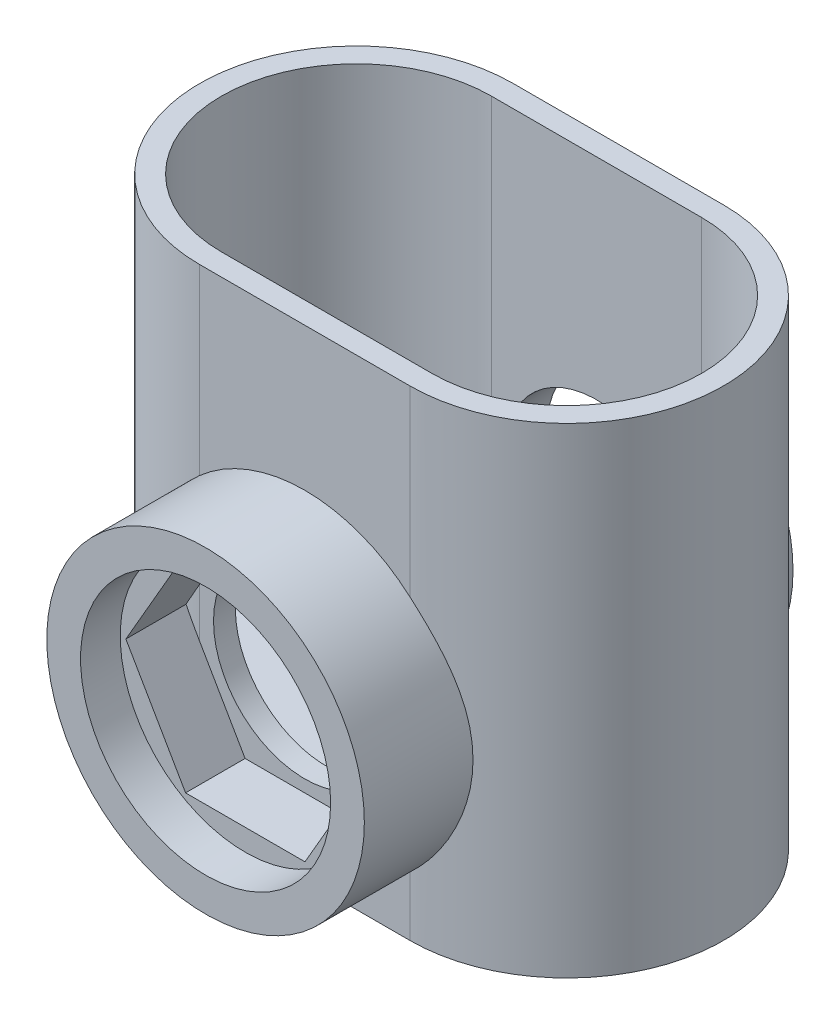
ISO-10303-21;
HEADER;
FILE_DESCRIPTION(('STEP AP214'),'2;1');
FILE_NAME('part.step','',(''),(''),'','','');
FILE_SCHEMA(('AUTOMOTIVE_DESIGN { 1 0 10303 214 1 1 1 1 }'));
ENDSEC;
DATA;
#1=APPLICATION_CONTEXT('core data for automotive mechanical design processes');
#2=APPLICATION_PROTOCOL_DEFINITION('international standard','automotive_design',2000,#1);
#3=PRODUCT_CONTEXT('',#1,'mechanical');
#4=PRODUCT('Part','Part','',(#3));
#5=PRODUCT_RELATED_PRODUCT_CATEGORY('part','',(#4));
#6=PRODUCT_DEFINITION_FORMATION('','',#4);
#7=PRODUCT_DEFINITION_CONTEXT('part definition',#1,'design');
#8=PRODUCT_DEFINITION('design','',#6,#7);
#9=PRODUCT_DEFINITION_SHAPE('','',#8);
#10=(LENGTH_UNIT() NAMED_UNIT(*) SI_UNIT(.MILLI.,.METRE.));
#11=(NAMED_UNIT(*) PLANE_ANGLE_UNIT() SI_UNIT($,.RADIAN.));
#12=(NAMED_UNIT(*) SI_UNIT($,.STERADIAN.) SOLID_ANGLE_UNIT());
#13=UNCERTAINTY_MEASURE_WITH_UNIT(LENGTH_MEASURE(1.E-05),#10,'distance_accuracy_value','');
#14=(GEOMETRIC_REPRESENTATION_CONTEXT(3) GLOBAL_UNCERTAINTY_ASSIGNED_CONTEXT((#13)) GLOBAL_UNIT_ASSIGNED_CONTEXT((#10,
#11,#12)) REPRESENTATION_CONTEXT('',''));
#15=CARTESIAN_POINT('',(0.,0.,0.));
#16=DIRECTION('',(0.,0.,1.));
#17=DIRECTION('',(1.,0.,0.));
#18=AXIS2_PLACEMENT_3D('',#15,#16,#17);
#19=CARTESIAN_POINT('',(5.3,9.,12.9));
#20=DIRECTION('',(0.,0.,-1.));
#21=DIRECTION('',(-1.,0.,0.));
#22=AXIS2_PLACEMENT_3D('',#19,#20,#21);
#23=CYLINDRICAL_SURFACE('',#22,4.6);
#24=CARTESIAN_POINT('',(5.3,9.,-6.8));
#25=DIRECTION('',(0.,0.,-1.));
#26=DIRECTION('',(-1.,0.,0.));
#27=AXIS2_PLACEMENT_3D('',#24,#25,#26);
#28=CIRCLE('',#27,4.6);
#29=CARTESIAN_POINT('',(0.700000000000001,9.,-6.8));
#30=VERTEX_POINT('',#29);
#31=EDGE_CURVE('E58',#30,#30,#28,.F.);
#32=ORIENTED_EDGE('',*,*,#31,.T.);
#33=EDGE_LOOP('',(#32));
#34=FACE_BOUND('',#33,.T.);
#35=CARTESIAN_POINT('',(5.3,9.,-8.9));
#36=DIRECTION('',(0.,0.,-1.));
#37=DIRECTION('',(-1.,0.,0.));
#38=AXIS2_PLACEMENT_3D('',#35,#36,#37);
#39=CIRCLE('',#38,4.6);
#40=CARTESIAN_POINT('',(0.700000000000001,9.,-8.9));
#41=VERTEX_POINT('',#40);
#42=EDGE_CURVE('E232',#41,#41,#39,.T.);
#43=ORIENTED_EDGE('',*,*,#42,.T.);
#44=EDGE_LOOP('',(#43));
#45=FACE_BOUND('',#44,.T.);
#46=ADVANCED_FACE('F54',(#34,#45),#23,.F.);
#47=CARTESIAN_POINT('',(0.,24.2,-7.9));
#48=DIRECTION('',(0.,0.,1.));
#49=DIRECTION('',(1.,0.,0.));
#50=AXIS2_PLACEMENT_3D('',#47,#48,#49);
#51=PLANE('',#50);
#52=CARTESIAN_POINT('',(5.3,9.,-7.9));
#53=DIRECTION('',(0.,0.,-1.));
#54=DIRECTION('',(-1.,0.,0.));
#55=AXIS2_PLACEMENT_3D('',#52,#53,#54);
#56=CIRCLE('',#55,7.8);
#57=CARTESIAN_POINT('',(10.6,3.2772384288702,-7.9));
#58=VERTEX_POINT('',#57);
#59=CARTESIAN_POINT('',(0.,3.2772384288702,-7.9));
#60=VERTEX_POINT('',#59);
#61=EDGE_CURVE('E79',#58,#60,#56,.T.);
#62=ORIENTED_EDGE('',*,*,#61,.F.);
#63=DIRECTION('',(0.,-1.,0.));
#64=VECTOR('',#63,1.);
#65=CARTESIAN_POINT('',(10.6,24.2,-7.9));
#66=LINE('',#65,#64);
#67=CARTESIAN_POINT('',(10.6,0.,-7.9));
#68=VERTEX_POINT('',#67);
#69=EDGE_CURVE('E356',#58,#68,#66,.T.);
#70=ORIENTED_EDGE('',*,*,#69,.T.);
#71=DIRECTION('',(-1.,0.,0.));
#72=VECTOR('',#71,1.);
#73=CARTESIAN_POINT('',(0.,0.,-7.9));
#74=LINE('',#73,#72);
#75=CARTESIAN_POINT('',(0.,0.,-7.9));
#76=VERTEX_POINT('',#75);
#77=EDGE_CURVE('E336',#68,#76,#74,.T.);
#78=ORIENTED_EDGE('',*,*,#77,.T.);
#79=DIRECTION('',(0.,-1.,0.));
#80=VECTOR('',#79,1.);
#81=CARTESIAN_POINT('',(0.,24.2,-7.9));
#82=LINE('',#81,#80);
#83=EDGE_CURVE('E342',#60,#76,#82,.T.);
#84=ORIENTED_EDGE('',*,*,#83,.F.);
#85=EDGE_LOOP('',(#62,#70,#78,#84));
#86=FACE_BOUND('',#85,.T.);
#87=ADVANCED_FACE('F393',(#86),#51,.F.);
#88=CARTESIAN_POINT('',(0.,14.7227615711298,-7.9));
#89=VERTEX_POINT('',#88);
#90=CARTESIAN_POINT('',(10.6,14.7227615711298,-7.9));
#91=VERTEX_POINT('',#90);
#92=EDGE_CURVE('E240',#89,#91,#56,.T.);
#93=ORIENTED_EDGE('',*,*,#92,.F.);
#94=CARTESIAN_POINT('',(0.,24.2,-7.9));
#95=VERTEX_POINT('',#94);
#96=EDGE_CURVE('E353',#95,#89,#82,.T.);
#97=ORIENTED_EDGE('',*,*,#96,.F.);
#98=DIRECTION('',(-1.,0.,0.));
#99=VECTOR('',#98,1.);
#100=CARTESIAN_POINT('',(0.,24.2,-7.9));
#101=LINE('',#100,#99);
#102=CARTESIAN_POINT('',(10.6,24.2,-7.9));
#103=VERTEX_POINT('',#102);
#104=EDGE_CURVE('E340',#103,#95,#101,.T.);
#105=ORIENTED_EDGE('',*,*,#104,.F.);
#106=EDGE_CURVE('E357',#103,#91,#66,.T.);
#107=ORIENTED_EDGE('',*,*,#106,.T.);
#108=EDGE_LOOP('',(#93,#97,#105,#107));
#109=FACE_BOUND('',#108,.T.);
#110=ADVANCED_FACE('F399',(#109),#51,.F.);
#111=CARTESIAN_POINT('',(0.,24.2,7.9));
#112=DIRECTION('',(0.,0.,-1.));
#113=DIRECTION('',(-1.,0.,0.));
#114=AXIS2_PLACEMENT_3D('',#111,#112,#113);
#115=PLANE('',#114);
#116=DIRECTION('',(0.,-1.,0.));
#117=VECTOR('',#116,1.);
#118=CARTESIAN_POINT('',(10.6,24.2,7.9));
#119=LINE('',#118,#117);
#120=CARTESIAN_POINT('',(10.6,3.00750469336854,7.9));
#121=VERTEX_POINT('',#120);
#122=CARTESIAN_POINT('',(10.6,0.,7.9));
#123=VERTEX_POINT('',#122);
#124=EDGE_CURVE('E359',#121,#123,#119,.T.);
#125=ORIENTED_EDGE('',*,*,#124,.F.);
#126=CARTESIAN_POINT('',(5.3,9.,7.90000000000646));
#127=DIRECTION('',(0.,0.,-1.));
#128=DIRECTION('',(-1.,0.,0.));
#129=AXIS2_PLACEMENT_3D('',#126,#127,#128);
#130=CIRCLE('',#129,8.);
#131=CARTESIAN_POINT('',(0.,3.00750469336854,7.9));
#132=VERTEX_POINT('',#131);
#133=EDGE_CURVE('E311',#132,#121,#130,.F.);
#134=ORIENTED_EDGE('',*,*,#133,.F.);
#135=DIRECTION('',(0.,-1.,0.));
#136=VECTOR('',#135,1.);
#137=CARTESIAN_POINT('',(0.,24.2,7.9));
#138=LINE('',#137,#136);
#139=CARTESIAN_POINT('',(0.,0.,7.9));
#140=VERTEX_POINT('',#139);
#141=EDGE_CURVE('E363',#132,#140,#138,.T.);
#142=ORIENTED_EDGE('',*,*,#141,.T.);
#143=DIRECTION('',(1.,0.,0.));
#144=VECTOR('',#143,1.);
#145=CARTESIAN_POINT('',(0.,0.,7.9));
#146=LINE('',#145,#144);
#147=EDGE_CURVE('E345',#140,#123,#146,.T.);
#148=ORIENTED_EDGE('',*,*,#147,.T.);
#149=EDGE_LOOP('',(#125,#134,#142,#148));
#150=FACE_BOUND('',#149,.T.);
#151=ADVANCED_FACE('F422',(#150),#115,.F.);
#152=CARTESIAN_POINT('',(0.,24.2,0.));
#153=DIRECTION('',(0.,-1.,0.));
#154=DIRECTION('',(0.,0.,-1.));
#155=AXIS2_PLACEMENT_3D('',#152,#153,#154);
#156=CYLINDRICAL_SURFACE('',#155,7.9);
#157=ORIENTED_EDGE('',*,*,#141,.F.);
#158=CARTESIAN_POINT('',(0.,14.9924953066315,7.9));
#159=CARTESIAN_POINT('',(-0.165659654042323,14.8460206283481,7.89999934958821));
#160=CARTESIAN_POINT('',(-0.325125716478624,14.6927039418768,7.89479037197899));
#161=CARTESIAN_POINT('',(-0.630504441524312,14.3737955911347,7.87628349925471));
#162=CARTESIAN_POINT('',(-0.776428295026014,14.2082142692084,7.86299235286839));
#163=CARTESIAN_POINT('',(-1.05369916417834,13.8661061195597,7.83065711055396));
#164=CARTESIAN_POINT('',(-1.18506043031419,13.6895902605375,7.81161870787881));
#165=CARTESIAN_POINT('',(-1.43266342855662,13.326604945252,7.77002182860017));
#166=CARTESIAN_POINT('',(-1.54890200233335,13.1401334212094,7.74746261884344));
#167=CARTESIAN_POINT('',(-1.76535237537247,12.7588238090764,7.70102332508906));
#168=CARTESIAN_POINT('',(-1.86559896624349,12.5640050863881,7.67714626492542));
#169=CARTESIAN_POINT('',(-2.04980814620565,12.1667420014171,7.63002810366607));
#170=CARTESIAN_POINT('',(-2.13377095767161,11.9642977433155,7.60678699388942));
#171=CARTESIAN_POINT('',(-2.2848637203706,11.5530034457817,7.56277686205978));
#172=CARTESIAN_POINT('',(-2.35199730782574,11.3441548010832,7.54200730649843));
#173=CARTESIAN_POINT('',(-2.46895935597311,10.9212989348312,7.50453305494014));
#174=CARTESIAN_POINT('',(-2.51878765816819,10.7072916660496,7.48782839617354));
#175=CARTESIAN_POINT('',(-2.60164662354409,10.2706221716192,7.45945075989015));
#176=CARTESIAN_POINT('',(-2.63426802769808,10.0478738839944,7.44790130089661));
#177=CARTESIAN_POINT('',(-2.68062892361512,9.60017193729785,7.43134163705504));
#178=CARTESIAN_POINT('',(-2.69436829056254,9.37521826365782,7.42633147543363));
#179=CARTESIAN_POINT('',(-2.70281529175459,8.92497740375368,7.42326142735091));
#180=CARTESIAN_POINT('',(-2.69752899363168,8.69969034671917,7.42519932502571));
#181=CARTESIAN_POINT('',(-2.66799541178477,8.25053326748999,7.43586214006958));
#182=CARTESIAN_POINT('',(-2.64374875180376,8.0266631989246,7.44458683417194));
#183=CARTESIAN_POINT('',(-2.57843553069375,7.59454677883346,7.46744846645516));
#184=CARTESIAN_POINT('',(-2.53838725389512,7.3861277165097,7.48125484962938));
#185=CARTESIAN_POINT('',(-2.44196525949885,6.97345808200345,7.51328044972511));
#186=CARTESIAN_POINT('',(-2.38559191676759,6.76920741421895,7.53149956531713));
#187=CARTESIAN_POINT('',(-2.25685676397906,6.36584055140364,7.57107207794247));
#188=CARTESIAN_POINT('',(-2.18447473154368,6.1667312094253,7.5924294276768));
#189=CARTESIAN_POINT('',(-2.02422693440841,5.77502193449221,7.63671468134105));
#190=CARTESIAN_POINT('',(-1.93636049541726,5.58242228544709,7.65964265363947));
#191=CARTESIAN_POINT('',(-1.7409570056299,5.1955065058327,7.70646807783583));
#192=CARTESIAN_POINT('',(-1.63266660248392,5.00156941317087,7.73035793101838));
#193=CARTESIAN_POINT('',(-1.40016919144706,4.62312234081302,7.77583138310324));
#194=CARTESIAN_POINT('',(-1.27595843103882,4.43861459805509,7.79741443607322));
#195=CARTESIAN_POINT('',(-1.01273479136636,4.08079536807202,7.83594359951493));
#196=CARTESIAN_POINT('',(-0.873766114614969,3.90745281228961,7.85290304295537));
#197=CARTESIAN_POINT('',(-0.581654865537745,3.57271709921554,7.87992091926252));
#198=CARTESIAN_POINT('',(-0.428524086428894,3.41131419746685,7.88998503638584));
#199=CARTESIAN_POINT('',(-0.225048015561031,3.21401815693188,7.89691598622943));
#200=CARTESIAN_POINT('',(-0.180692272938848,3.17198573349581,7.89806066824444));
#201=CARTESIAN_POINT('',(-0.0910468224072934,3.08896451586404,7.89960238262781));
#202=CARTESIAN_POINT('',(-0.0457576352332591,3.04797516684869,7.89999982102299));
#203=CARTESIAN_POINT('',(0.,3.00750469336854,7.9));
#204=B_SPLINE_CURVE_WITH_KNOTS('',3,(#158,#159,#160,#161,#162,#163,#164,#165,#166,#167,#168,
#169,#170,#171,#172,#173,#174,#175,#176,#177,#178,#179,#180,#181,#182,#183,#184,#185,#186,#187,
#188,#189,#190,#191,#192,#193,#194,#195,#196,#197,#198,#199,#200,#201,#202,#203),.UNSPECIFIED.,
.F.,.F.,(4,2,2,2,2,2,2,2,2,2,2,2,2,2,2,2,2,2,2,2,2,2,4),(0.,0.662981875407768,1.32541091002921,
1.98718588144885,2.64909884151636,3.30955152723226,3.96999519302776,4.63029603620857,
5.2906029268507,5.96597762938779,6.64135679632178,7.31652059157958,7.99166217676743,
8.62898434784936,9.26629188550103,9.90440912344751,10.5425541560181,11.2119948281525,
11.8815935823791,12.5492405041256,13.2163363776241,13.3996777805269,13.58291953311),.UNSPECIFIED.);
#205=CARTESIAN_POINT('',(0.,14.9924953066315,7.9));
#206=VERTEX_POINT('',#205);
#207=EDGE_CURVE('E285',#206,#132,#204,.T.);
#208=ORIENTED_EDGE('',*,*,#207,.F.);
#209=CARTESIAN_POINT('',(0.,24.2,7.9));
#210=VERTEX_POINT('',#209);
#211=EDGE_CURVE('E63',#210,#206,#138,.T.);
#212=ORIENTED_EDGE('',*,*,#211,.F.);
#213=CARTESIAN_POINT('',(0.,24.2,0.));
#214=DIRECTION('',(0.,1.,0.));
#215=DIRECTION('',(0.,0.,1.));
#216=AXIS2_PLACEMENT_3D('',#213,#214,#215);
#217=CIRCLE('',#216,7.9);
#218=EDGE_CURVE('E332',#95,#210,#217,.T.);
#219=ORIENTED_EDGE('',*,*,#218,.F.);
#220=ORIENTED_EDGE('',*,*,#96,.T.);
#221=DIRECTION('',(0.,-1.,0.));
#222=VECTOR('',#221,1.);
#223=CARTESIAN_POINT('',(0.,24.2,-7.9));
#224=LINE('',#223,#222);
#225=EDGE_CURVE('E246',#89,#60,#224,.T.);
#226=ORIENTED_EDGE('',*,*,#225,.T.);
#227=ORIENTED_EDGE('',*,*,#83,.T.);
#228=CARTESIAN_POINT('',(0.,0.,0.));
#229=DIRECTION('',(0.,1.,0.));
#230=DIRECTION('',(0.,0.,1.));
#231=AXIS2_PLACEMENT_3D('',#228,#229,#230);
#232=CIRCLE('',#231,7.9);
#233=EDGE_CURVE('E320',#76,#140,#232,.T.);
#234=ORIENTED_EDGE('',*,*,#233,.T.);
#235=EDGE_LOOP('',(#157,#208,#212,#219,#220,#226,#227,#234));
#236=FACE_BOUND('',#235,.T.);
#237=ADVANCED_FACE('F56',(#236),#156,.T.);
#238=ORIENTED_EDGE('',*,*,#211,.T.);
#239=CARTESIAN_POINT('',(10.6,14.9924953066315,7.90000000000646));
#240=VERTEX_POINT('',#239);
#241=EDGE_CURVE('E294',#240,#206,#130,.F.);
#242=ORIENTED_EDGE('',*,*,#241,.F.);
#243=CARTESIAN_POINT('',(10.6,24.2,7.9));
#244=VERTEX_POINT('',#243);
#245=EDGE_CURVE('E360',#244,#240,#119,.T.);
#246=ORIENTED_EDGE('',*,*,#245,.F.);
#247=DIRECTION('',(1.,0.,0.));
#248=VECTOR('',#247,1.);
#249=CARTESIAN_POINT('',(0.,24.2,7.9));
#250=LINE('',#249,#248);
#251=EDGE_CURVE('E335',#210,#244,#250,.T.);
#252=ORIENTED_EDGE('',*,*,#251,.F.);
#253=EDGE_LOOP('',(#238,#242,#246,#252));
#254=FACE_BOUND('',#253,.T.);
#255=ADVANCED_FACE('F423',(#254),#115,.F.);
#256=CARTESIAN_POINT('',(10.6,24.2,0.));
#257=DIRECTION('',(0.,-1.,0.));
#258=DIRECTION('',(0.,0.,-1.));
#259=AXIS2_PLACEMENT_3D('',#256,#257,#258);
#260=CYLINDRICAL_SURFACE('',#259,7.9);
#261=ORIENTED_EDGE('',*,*,#245,.T.);
#262=CARTESIAN_POINT('',(10.6,3.00750469336854,7.9));
#263=CARTESIAN_POINT('',(10.7656596540423,3.15397937165192,7.89999934958821));
#264=CARTESIAN_POINT('',(10.9251257164786,3.30729605812319,7.89479037197899));
#265=CARTESIAN_POINT('',(11.2305044415243,3.62620440886528,7.87628349925471));
#266=CARTESIAN_POINT('',(11.376428295026,3.79178573079156,7.86299235286839));
#267=CARTESIAN_POINT('',(11.6536991641783,4.13389388044027,7.83065711055396));
#268=CARTESIAN_POINT('',(11.7850604303142,4.31040973946249,7.81161870787881));
#269=CARTESIAN_POINT('',(12.0326634285566,4.67339505474797,7.77002182860017));
#270=CARTESIAN_POINT('',(12.1489020023334,4.85986657879061,7.74746261884344));
#271=CARTESIAN_POINT('',(12.3653523753725,5.24117619092359,7.70102332508906));
#272=CARTESIAN_POINT('',(12.4655989662435,5.43599491361189,7.67714626492542));
#273=CARTESIAN_POINT('',(12.6498081462056,5.83325799858287,7.63002810366607));
#274=CARTESIAN_POINT('',(12.7337709576716,6.03570225668449,7.60678699388942));
#275=CARTESIAN_POINT('',(12.8848637203706,6.44699655421832,7.56277686205978));
#276=CARTESIAN_POINT('',(12.9519973078257,6.65584519891677,7.54200730649843));
#277=CARTESIAN_POINT('',(13.0689593559731,7.07870106516878,7.50453305494014));
#278=CARTESIAN_POINT('',(13.1187876581682,7.29270833395039,7.48782839617354));
#279=CARTESIAN_POINT('',(13.2016466235441,7.72937782838078,7.45945075989015));
#280=CARTESIAN_POINT('',(13.2342680276981,7.9521261160056,7.44790130089661));
#281=CARTESIAN_POINT('',(13.2806289236151,8.39982806270214,7.43134163705504));
#282=CARTESIAN_POINT('',(13.2943682905625,8.62478173634218,7.42633147543363));
#283=CARTESIAN_POINT('',(13.3028152917546,9.07502259624631,7.42326142735091));
#284=CARTESIAN_POINT('',(13.2975289936317,9.30030965328083,7.42519932502571));
#285=CARTESIAN_POINT('',(13.2679954117848,9.74946673251,7.43586214006958));
#286=CARTESIAN_POINT('',(13.2437487518038,9.97333680107539,7.44458683417194));
#287=CARTESIAN_POINT('',(13.1784355306938,10.4054532211665,7.46744846645516));
#288=CARTESIAN_POINT('',(13.1383872538951,10.6138722834903,7.48125484962938));
#289=CARTESIAN_POINT('',(13.0419652594989,11.0265419179965,7.51328044972511));
#290=CARTESIAN_POINT('',(12.9855919167676,11.230792585781,7.53149956531713));
#291=CARTESIAN_POINT('',(12.8568567639791,11.6341594485963,7.57107207794247));
#292=CARTESIAN_POINT('',(12.7844747315437,11.8332687905747,7.5924294276768));
#293=CARTESIAN_POINT('',(12.6242269344084,12.2249780655078,7.63671468134105));
#294=CARTESIAN_POINT('',(12.5363604954173,12.4175777145529,7.65964265363947));
#295=CARTESIAN_POINT('',(12.3409570056299,12.8044934941673,7.70646807783583));
#296=CARTESIAN_POINT('',(12.2326666024839,12.9984305868291,7.73035793101838));
#297=CARTESIAN_POINT('',(12.0001691914471,13.376877659187,7.77583138310323));
#298=CARTESIAN_POINT('',(11.8759584310388,13.5613854019449,7.79741443607321));
#299=CARTESIAN_POINT('',(11.6127347913664,13.919204631928,7.83594359951493));
#300=CARTESIAN_POINT('',(11.473766114615,14.0925471877104,7.85290304295537));
#301=CARTESIAN_POINT('',(11.1816548655378,14.4272829007845,7.87992091926252));
#302=CARTESIAN_POINT('',(11.0285240864289,14.5886858025331,7.88998503638584));
#303=CARTESIAN_POINT('',(10.825048015561,14.7859818430681,7.89691598622943));
#304=CARTESIAN_POINT('',(10.7806922729389,14.8280142665042,7.89806066824444));
#305=CARTESIAN_POINT('',(10.6910468224073,14.911035484136,7.89960238262781));
#306=CARTESIAN_POINT('',(10.6457576352333,14.9520248331513,7.89999982102299));
#307=CARTESIAN_POINT('',(10.6,14.9924953066315,7.9));
#308=B_SPLINE_CURVE_WITH_KNOTS('',3,(#262,#263,#264,#265,#266,#267,#268,#269,#270,#271,#272,
#273,#274,#275,#276,#277,#278,#279,#280,#281,#282,#283,#284,#285,#286,#287,#288,#289,#290,#291,
#292,#293,#294,#295,#296,#297,#298,#299,#300,#301,#302,#303,#304,#305,#306,#307),.UNSPECIFIED.,
.F.,.F.,(4,2,2,2,2,2,2,2,2,2,2,2,2,2,2,2,2,2,2,2,2,2,4),(0.,0.662981875407767,1.32541091002921,
1.98718588144885,2.64909884151636,3.30955152723226,3.96999519302775,4.63029603620857,
5.2906029268507,5.96597762938779,6.64135679632178,7.31652059157957,7.99166217676742,
8.62898434784936,9.26629188550102,9.90440912344751,10.5425541560181,11.2119948281525,
11.8815935823791,12.5492405041256,13.2163363776241,13.3996777805269,13.58291953311),.UNSPECIFIED.);
#309=EDGE_CURVE('E305',#121,#240,#308,.T.);
#310=ORIENTED_EDGE('',*,*,#309,.F.);
#311=ORIENTED_EDGE('',*,*,#124,.T.);
#312=CARTESIAN_POINT('',(10.6,0.,0.));
#313=DIRECTION('',(0.,1.,0.));
#314=DIRECTION('',(0.,0.,1.));
#315=AXIS2_PLACEMENT_3D('',#312,#313,#314);
#316=CIRCLE('',#315,7.9);
#317=EDGE_CURVE('E348',#123,#68,#316,.T.);
#318=ORIENTED_EDGE('',*,*,#317,.T.);
#319=ORIENTED_EDGE('',*,*,#69,.F.);
#320=DIRECTION('',(0.,-1.,0.));
#321=VECTOR('',#320,1.);
#322=CARTESIAN_POINT('',(10.6,24.2,-7.9));
#323=LINE('',#322,#321);
#324=EDGE_CURVE('E239',#91,#58,#323,.T.);
#325=ORIENTED_EDGE('',*,*,#324,.F.);
#326=ORIENTED_EDGE('',*,*,#106,.F.);
#327=CARTESIAN_POINT('',(10.6,24.2,0.));
#328=DIRECTION('',(0.,1.,0.));
#329=DIRECTION('',(0.,0.,1.));
#330=AXIS2_PLACEMENT_3D('',#327,#328,#329);
#331=CIRCLE('',#330,7.9);
#332=EDGE_CURVE('E338',#244,#103,#331,.T.);
#333=ORIENTED_EDGE('',*,*,#332,.F.);
#334=EDGE_LOOP('',(#261,#310,#311,#318,#319,#325,#326,#333));
#335=FACE_BOUND('',#334,.T.);
#336=ADVANCED_FACE('F471',(#335),#260,.T.);
#337=CARTESIAN_POINT('',(0.,24.2,0.));
#338=DIRECTION('',(0.,1.,0.));
#339=DIRECTION('',(0.,0.,1.));
#340=AXIS2_PLACEMENT_3D('',#337,#338,#339);
#341=PLANE('',#340);
#342=DIRECTION('',(-1.,0.,0.));
#343=VECTOR('',#342,1.);
#344=CARTESIAN_POINT('',(0.,24.2,-6.8));
#345=LINE('',#344,#343);
#346=CARTESIAN_POINT('',(10.6,24.2,-6.8));
#347=VERTEX_POINT('',#346);
#348=CARTESIAN_POINT('',(0.,24.2,-6.8));
#349=VERTEX_POINT('',#348);
#350=EDGE_CURVE('E71',#347,#349,#345,.T.);
#351=ORIENTED_EDGE('',*,*,#350,.F.);
#352=CARTESIAN_POINT('',(10.6,24.2,0.));
#353=DIRECTION('',(0.,1.,0.));
#354=DIRECTION('',(0.,0.,1.));
#355=AXIS2_PLACEMENT_3D('',#352,#353,#354);
#356=CIRCLE('',#355,6.8);
#357=CARTESIAN_POINT('',(10.6,24.2,6.8));
#358=VERTEX_POINT('',#357);
#359=EDGE_CURVE('E213',#358,#347,#356,.T.);
#360=ORIENTED_EDGE('',*,*,#359,.F.);
#361=DIRECTION('',(1.,0.,0.));
#362=VECTOR('',#361,1.);
#363=CARTESIAN_POINT('',(0.,24.2,6.8));
#364=LINE('',#363,#362);
#365=CARTESIAN_POINT('',(0.,24.2,6.8));
#366=VERTEX_POINT('',#365);
#367=EDGE_CURVE('E216',#366,#358,#364,.T.);
#368=ORIENTED_EDGE('',*,*,#367,.F.);
#369=CARTESIAN_POINT('',(0.,24.2,0.));
#370=DIRECTION('',(0.,1.,0.));
#371=DIRECTION('',(0.,0.,1.));
#372=AXIS2_PLACEMENT_3D('',#369,#370,#371);
#373=CIRCLE('',#372,6.8);
#374=EDGE_CURVE('E222',#349,#366,#373,.T.);
#375=ORIENTED_EDGE('',*,*,#374,.F.);
#376=EDGE_LOOP('',(#351,#360,#368,#375));
#377=FACE_BOUND('',#376,.T.);
#378=ORIENTED_EDGE('',*,*,#218,.T.);
#379=ORIENTED_EDGE('',*,*,#251,.T.);
#380=ORIENTED_EDGE('',*,*,#332,.T.);
#381=ORIENTED_EDGE('',*,*,#104,.T.);
#382=EDGE_LOOP('',(#378,#379,#380,#381));
#383=FACE_BOUND('',#382,.T.);
#384=ADVANCED_FACE('F303',(#377,#383),#341,.T.);
#385=CARTESIAN_POINT('',(0.,0.,0.));
#386=DIRECTION('',(0.,1.,0.));
#387=DIRECTION('',(0.,0.,1.));
#388=AXIS2_PLACEMENT_3D('',#385,#386,#387);
#389=PLANE('',#388);
#390=ORIENTED_EDGE('',*,*,#233,.F.);
#391=ORIENTED_EDGE('',*,*,#77,.F.);
#392=ORIENTED_EDGE('',*,*,#317,.F.);
#393=ORIENTED_EDGE('',*,*,#147,.F.);
#394=EDGE_LOOP('',(#390,#391,#392,#393));
#395=FACE_BOUND('',#394,.T.);
#396=ADVANCED_FACE('F465',(#395),#389,.F.);
#397=CARTESIAN_POINT('',(5.3,9.,12.9));
#398=DIRECTION('',(0.,0.,1.));
#399=DIRECTION('',(1.,0.,0.));
#400=AXIS2_PLACEMENT_3D('',#397,#398,#399);
#401=PLANE('',#400);
#402=CARTESIAN_POINT('',(5.3,9.,12.9));
#403=DIRECTION('',(0.,0.,1.));
#404=DIRECTION('',(1.,0.,0.));
#405=AXIS2_PLACEMENT_3D('',#402,#403,#404);
#406=CIRCLE('',#405,6.3);
#407=CARTESIAN_POINT('',(11.6,9.,12.9));
#408=VERTEX_POINT('',#407);
#409=EDGE_CURVE('E254',#408,#408,#406,.T.);
#410=ORIENTED_EDGE('',*,*,#409,.F.);
#411=EDGE_LOOP('',(#410));
#412=FACE_BOUND('',#411,.T.);
#413=CARTESIAN_POINT('',(5.3,9.,12.9));
#414=DIRECTION('',(0.,0.,1.));
#415=DIRECTION('',(1.,0.,0.));
#416=AXIS2_PLACEMENT_3D('',#413,#414,#415);
#417=CIRCLE('',#416,8.);
#418=CARTESIAN_POINT('',(13.3,9.,12.9));
#419=VERTEX_POINT('',#418);
#420=EDGE_CURVE('E266',#419,#419,#417,.T.);
#421=ORIENTED_EDGE('',*,*,#420,.T.);
#422=EDGE_LOOP('',(#421));
#423=FACE_BOUND('',#422,.T.);
#424=ADVANCED_FACE('F620',(#412,#423),#401,.T.);
#425=CARTESIAN_POINT('',(5.3,9.,-500000.));
#426=DIRECTION('',(0.,0.,1.));
#427=DIRECTION('',(1.,0.,0.));
#428=AXIS2_PLACEMENT_3D('',#425,#426,#427);
#429=CYLINDRICAL_SURFACE('',#428,8.);
#430=ORIENTED_EDGE('',*,*,#420,.F.);
#431=EDGE_LOOP('',(#430));
#432=FACE_BOUND('',#431,.T.);
#433=ORIENTED_EDGE('',*,*,#133,.T.);
#434=ORIENTED_EDGE('',*,*,#309,.T.);
#435=ORIENTED_EDGE('',*,*,#241,.T.);
#436=ORIENTED_EDGE('',*,*,#207,.T.);
#437=EDGE_LOOP('',(#433,#434,#435,#436));
#438=FACE_BOUND('',#437,.T.);
#439=ADVANCED_FACE('F296',(#432,#438),#429,.T.);
#440=CARTESIAN_POINT('',(5.3,9.,10.9));
#441=DIRECTION('',(0.,0.,1.));
#442=DIRECTION('',(1.,0.,0.));
#443=AXIS2_PLACEMENT_3D('',#440,#441,#442);
#444=PLANE('',#443);
#445=CARTESIAN_POINT('',(5.3,9.,10.9));
#446=DIRECTION('',(0.,0.,1.));
#447=DIRECTION('',(1.,0.,0.));
#448=AXIS2_PLACEMENT_3D('',#445,#446,#447);
#449=CIRCLE('',#448,6.3);
#450=CARTESIAN_POINT('',(11.6,9.,10.9));
#451=VERTEX_POINT('',#450);
#452=EDGE_CURVE('E250',#451,#451,#449,.T.);
#453=ORIENTED_EDGE('',*,*,#452,.T.);
#454=EDGE_LOOP('',(#453));
#455=FACE_BOUND('',#454,.T.);
#456=DIRECTION('',(-0.5,-0.866025403784439,0.));
#457=VECTOR('',#456,1.);
#458=CARTESIAN_POINT('',(8.30799490247795,3.79,10.8999999999924));
#459=LINE('',#458,#457);
#460=CARTESIAN_POINT('',(11.3159898049559,9.,10.8999999999924));
#461=VERTEX_POINT('',#460);
#462=CARTESIAN_POINT('',(8.30799490247795,3.79,10.8999999999924));
#463=VERTEX_POINT('',#462);
#464=EDGE_CURVE('E264',#461,#463,#459,.T.);
#465=ORIENTED_EDGE('',*,*,#464,.T.);
#466=DIRECTION('',(-1.,0.,0.));
#467=VECTOR('',#466,1.);
#468=CARTESIAN_POINT('',(2.29200509752205,3.79,10.8999999999924));
#469=LINE('',#468,#467);
#470=CARTESIAN_POINT('',(2.29200509752205,3.79,10.8999999999924));
#471=VERTEX_POINT('',#470);
#472=EDGE_CURVE('E262',#463,#471,#469,.T.);
#473=ORIENTED_EDGE('',*,*,#472,.T.);
#474=DIRECTION('',(-0.5,0.866025403784439,0.));
#475=VECTOR('',#474,1.);
#476=CARTESIAN_POINT('',(-0.715989804955899,9.,10.8999999999924));
#477=LINE('',#476,#475);
#478=CARTESIAN_POINT('',(-0.715989804955898,9.,10.8999999999924));
#479=VERTEX_POINT('',#478);
#480=EDGE_CURVE('E260',#471,#479,#477,.T.);
#481=ORIENTED_EDGE('',*,*,#480,.T.);
#482=DIRECTION('',(0.5,0.866025403784439,0.));
#483=VECTOR('',#482,1.);
#484=CARTESIAN_POINT('',(2.29200509752205,14.21,10.8999999999924));
#485=LINE('',#484,#483);
#486=CARTESIAN_POINT('',(2.29200509752205,14.21,10.8999999998787));
#487=VERTEX_POINT('',#486);
#488=EDGE_CURVE('E258',#479,#487,#485,.T.);
#489=ORIENTED_EDGE('',*,*,#488,.T.);
#490=DIRECTION('',(1.,0.,0.));
#491=VECTOR('',#490,1.);
#492=CARTESIAN_POINT('',(8.30799490247796,14.21,10.8999999999924));
#493=LINE('',#492,#491);
#494=CARTESIAN_POINT('',(8.30799490247796,14.21,10.8999999999924));
#495=VERTEX_POINT('',#494);
#496=EDGE_CURVE('E12',#487,#495,#493,.T.);
#497=ORIENTED_EDGE('',*,*,#496,.T.);
#498=DIRECTION('',(0.5,-0.866025403784439,0.));
#499=VECTOR('',#498,1.);
#500=CARTESIAN_POINT('',(11.3159898049559,9.,10.8999999999924));
#501=LINE('',#500,#499);
#502=EDGE_CURVE('E253',#495,#461,#501,.T.);
#503=ORIENTED_EDGE('',*,*,#502,.T.);
#504=EDGE_LOOP('',(#465,#473,#481,#489,#497,#503));
#505=FACE_BOUND('',#504,.T.);
#506=ADVANCED_FACE('F609',(#455,#505),#444,.T.);
#507=CARTESIAN_POINT('',(5.3,9.,10.9));
#508=DIRECTION('',(0.,0.,1.));
#509=DIRECTION('',(1.,0.,0.));
#510=AXIS2_PLACEMENT_3D('',#507,#508,#509);
#511=CYLINDRICAL_SURFACE('',#510,6.3);
#512=ORIENTED_EDGE('',*,*,#452,.F.);
#513=EDGE_LOOP('',(#512));
#514=FACE_BOUND('',#513,.T.);
#515=ORIENTED_EDGE('',*,*,#409,.T.);
#516=EDGE_LOOP('',(#515));
#517=FACE_BOUND('',#516,.T.);
#518=ADVANCED_FACE('F604',(#514,#517),#511,.F.);
#519=CARTESIAN_POINT('',(0.,7.75986928011505,0.));
#520=DIRECTION('',(-0.866025403784439,-0.5,0.));
#521=DIRECTION('',(0.5,-0.866025403784439,0.));
#522=AXIS2_PLACEMENT_3D('',#519,#520,#521);
#523=ELLIPSE('',#522,15.8,7.9);
#524=CARTESIAN_POINT('',(-0.715989804955899,9.,7.8674874385456));
#525=VERTEX_POINT('',#524);
#526=CARTESIAN_POINT('',(0.,7.75986928011505,7.9));
#527=VERTEX_POINT('',#526);
#528=EDGE_CURVE('E316',#525,#527,#523,.F.);
#529=ORIENTED_EDGE('',*,*,#528,.T.);
#530=CARTESIAN_POINT('',(0.,10.2401307198849,7.9));
#531=VERTEX_POINT('',#530);
#532=EDGE_CURVE('E366',#531,#527,#138,.T.);
#533=ORIENTED_EDGE('',*,*,#532,.F.);
#534=CARTESIAN_POINT('',(0.,10.2401307198849,0.));
#535=DIRECTION('',(-0.866025403784439,0.5,0.));
#536=DIRECTION('',(-0.5,-0.866025403784439,0.));
#537=AXIS2_PLACEMENT_3D('',#534,#535,#536);
#538=ELLIPSE('',#537,15.8,7.9);
#539=EDGE_CURVE('E312',#531,#525,#538,.F.);
#540=ORIENTED_EDGE('',*,*,#539,.T.);
#541=EDGE_LOOP('',(#529,#533,#540));
#542=FACE_BOUND('',#541,.T.);
#543=ADVANCED_FACE('F453',(#542),#156,.T.);
#544=CARTESIAN_POINT('',(10.6,7.75986928011505,0.));
#545=DIRECTION('',(0.866025403784439,-0.5,0.));
#546=DIRECTION('',(-0.5,-0.866025403784439,0.));
#547=AXIS2_PLACEMENT_3D('',#544,#545,#546);
#548=ELLIPSE('',#547,15.8,7.9);
#549=CARTESIAN_POINT('',(10.6,7.75986928011505,7.9));
#550=VERTEX_POINT('',#549);
#551=CARTESIAN_POINT('',(11.3159898049559,9.,7.8674874385456));
#552=VERTEX_POINT('',#551);
#553=EDGE_CURVE('E324',#550,#552,#548,.F.);
#554=ORIENTED_EDGE('',*,*,#553,.T.);
#555=CARTESIAN_POINT('',(10.6,10.240130719885,0.));
#556=DIRECTION('',(0.866025403784439,0.5,0.));
#557=DIRECTION('',(0.5,-0.866025403784439,0.));
#558=AXIS2_PLACEMENT_3D('',#555,#556,#557);
#559=ELLIPSE('',#558,15.8,7.9);
#560=CARTESIAN_POINT('',(10.6,10.240130719885,7.9));
#561=VERTEX_POINT('',#560);
#562=EDGE_CURVE('E310',#552,#561,#559,.F.);
#563=ORIENTED_EDGE('',*,*,#562,.T.);
#564=EDGE_CURVE('E364',#561,#550,#119,.T.);
#565=ORIENTED_EDGE('',*,*,#564,.T.);
#566=EDGE_LOOP('',(#554,#563,#565));
#567=FACE_BOUND('',#566,.T.);
#568=ADVANCED_FACE('F421',(#567),#260,.T.);
#569=CARTESIAN_POINT('',(5.3,9.,7.9));
#570=DIRECTION('',(0.,0.,-1.));
#571=DIRECTION('',(-1.,0.,0.));
#572=AXIS2_PLACEMENT_3D('',#569,#570,#571);
#573=CIRCLE('',#572,4.6);
#574=CARTESIAN_POINT('',(0.700000000000001,9.,7.9));
#575=VERTEX_POINT('',#574);
#576=EDGE_CURVE('E249',#575,#575,#573,.T.);
#577=ORIENTED_EDGE('',*,*,#576,.T.);
#578=EDGE_LOOP('',(#577));
#579=FACE_BOUND('',#578,.T.);
#580=DIRECTION('',(0.5,0.866025403784439,0.));
#581=VECTOR('',#580,1.);
#582=CARTESIAN_POINT('',(8.30799490247795,3.79,7.90000000000646));
#583=LINE('',#582,#581);
#584=CARTESIAN_POINT('',(8.30799490247795,3.79,7.9));
#585=VERTEX_POINT('',#584);
#586=EDGE_CURVE('E328',#585,#550,#583,.T.);
#587=ORIENTED_EDGE('',*,*,#586,.T.);
#588=ORIENTED_EDGE('',*,*,#564,.F.);
#589=DIRECTION('',(-0.5,0.866025403784439,0.));
#590=VECTOR('',#589,1.);
#591=CARTESIAN_POINT('',(11.3159898049559,9.,7.90000000000646));
#592=LINE('',#591,#590);
#593=CARTESIAN_POINT('',(8.30799490247796,14.21,7.9));
#594=VERTEX_POINT('',#593);
#595=EDGE_CURVE('E322',#561,#594,#592,.T.);
#596=ORIENTED_EDGE('',*,*,#595,.T.);
#597=DIRECTION('',(-1.,0.,0.));
#598=VECTOR('',#597,1.);
#599=CARTESIAN_POINT('',(8.30799490247796,14.21,7.90000000000646));
#600=LINE('',#599,#598);
#601=CARTESIAN_POINT('',(2.29200509752205,14.21,7.9));
#602=VERTEX_POINT('',#601);
#603=EDGE_CURVE('E314',#594,#602,#600,.T.);
#604=ORIENTED_EDGE('',*,*,#603,.T.);
#605=DIRECTION('',(-0.5,-0.866025403784439,0.));
#606=VECTOR('',#605,1.);
#607=CARTESIAN_POINT('',(2.29200509752205,14.21,7.90000000000646));
#608=LINE('',#607,#606);
#609=EDGE_CURVE('E315',#602,#531,#608,.T.);
#610=ORIENTED_EDGE('',*,*,#609,.T.);
#611=ORIENTED_EDGE('',*,*,#532,.T.);
#612=DIRECTION('',(0.5,-0.866025403784439,0.));
#613=VECTOR('',#612,1.);
#614=CARTESIAN_POINT('',(-0.715989804955899,9.,7.90000000000646));
#615=LINE('',#614,#613);
#616=CARTESIAN_POINT('',(2.29200509752205,3.79,7.9));
#617=VERTEX_POINT('',#616);
#618=EDGE_CURVE('E318',#527,#617,#615,.T.);
#619=ORIENTED_EDGE('',*,*,#618,.T.);
#620=DIRECTION('',(1.,0.,0.));
#621=VECTOR('',#620,1.);
#622=CARTESIAN_POINT('',(2.29200509752205,3.79,7.90000000000646));
#623=LINE('',#622,#621);
#624=EDGE_CURVE('E326',#617,#585,#623,.T.);
#625=ORIENTED_EDGE('',*,*,#624,.T.);
#626=EDGE_LOOP('',(#587,#588,#596,#604,#610,#611,#619,#625));
#627=FACE_BOUND('',#626,.T.);
#628=ADVANCED_FACE('F417',(#579,#627),#115,.F.);
#629=CARTESIAN_POINT('',(8.30799490247796,14.21,-500000.));
#630=DIRECTION('',(0.,1.,0.));
#631=DIRECTION('',(0.,0.,1.));
#632=AXIS2_PLACEMENT_3D('',#629,#630,#631);
#633=PLANE('',#632);
#634=ORIENTED_EDGE('',*,*,#496,.F.);
#635=DIRECTION('',(0.,0.,1.));
#636=VECTOR('',#635,1.);
#637=CARTESIAN_POINT('',(2.29200509752205,14.21,-500000.));
#638=LINE('',#637,#636);
#639=EDGE_CURVE('E272',#602,#487,#638,.T.);
#640=ORIENTED_EDGE('',*,*,#639,.F.);
#641=ORIENTED_EDGE('',*,*,#603,.F.);
#642=DIRECTION('',(0.,0.,1.));
#643=VECTOR('',#642,1.);
#644=CARTESIAN_POINT('',(8.30799490247796,14.21,-500000.));
#645=LINE('',#644,#643);
#646=EDGE_CURVE('E269',#594,#495,#645,.T.);
#647=ORIENTED_EDGE('',*,*,#646,.T.);
#648=EDGE_LOOP('',(#634,#640,#641,#647));
#649=FACE_BOUND('',#648,.T.);
#650=ADVANCED_FACE('F420',(#649),#633,.F.);
#651=CARTESIAN_POINT('',(11.3159898049559,9.,-500000.));
#652=DIRECTION('',(0.866025403784439,0.5,0.));
#653=DIRECTION('',(-0.5,0.866025403784439,0.));
#654=AXIS2_PLACEMENT_3D('',#651,#652,#653);
#655=PLANE('',#654);
#656=ORIENTED_EDGE('',*,*,#502,.F.);
#657=ORIENTED_EDGE('',*,*,#646,.F.);
#658=ORIENTED_EDGE('',*,*,#595,.F.);
#659=ORIENTED_EDGE('',*,*,#562,.F.);
#660=DIRECTION('',(0.,0.,1.));
#661=VECTOR('',#660,1.);
#662=CARTESIAN_POINT('',(11.3159898049559,9.,-500000.));
#663=LINE('',#662,#661);
#664=EDGE_CURVE('E282',#552,#461,#663,.T.);
#665=ORIENTED_EDGE('',*,*,#664,.T.);
#666=EDGE_LOOP('',(#656,#657,#658,#659,#665));
#667=FACE_BOUND('',#666,.T.);
#668=ADVANCED_FACE('F437',(#667),#655,.F.);
#669=CARTESIAN_POINT('',(2.29200509752205,14.21,-500000.));
#670=DIRECTION('',(-0.866025403784439,0.5,0.));
#671=DIRECTION('',(-0.5,-0.866025403784439,0.));
#672=AXIS2_PLACEMENT_3D('',#669,#670,#671);
#673=PLANE('',#672);
#674=ORIENTED_EDGE('',*,*,#488,.F.);
#675=DIRECTION('',(0.,0.,1.));
#676=VECTOR('',#675,1.);
#677=CARTESIAN_POINT('',(-0.715989804955899,9.,-500000.));
#678=LINE('',#677,#676);
#679=EDGE_CURVE('E275',#525,#479,#678,.T.);
#680=ORIENTED_EDGE('',*,*,#679,.F.);
#681=ORIENTED_EDGE('',*,*,#539,.F.);
#682=ORIENTED_EDGE('',*,*,#609,.F.);
#683=ORIENTED_EDGE('',*,*,#639,.T.);
#684=EDGE_LOOP('',(#674,#680,#681,#682,#683));
#685=FACE_BOUND('',#684,.T.);
#686=ADVANCED_FACE('F446',(#685),#673,.F.);
#687=CARTESIAN_POINT('',(-0.715989804955899,9.,-500000.));
#688=DIRECTION('',(-0.866025403784439,-0.5,0.));
#689=DIRECTION('',(0.5,-0.866025403784439,0.));
#690=AXIS2_PLACEMENT_3D('',#687,#688,#689);
#691=PLANE('',#690);
#692=ORIENTED_EDGE('',*,*,#480,.F.);
#693=DIRECTION('',(0.,0.,1.));
#694=VECTOR('',#693,1.);
#695=CARTESIAN_POINT('',(2.29200509752205,3.79,-500000.));
#696=LINE('',#695,#694);
#697=EDGE_CURVE('E278',#617,#471,#696,.T.);
#698=ORIENTED_EDGE('',*,*,#697,.F.);
#699=ORIENTED_EDGE('',*,*,#618,.F.);
#700=ORIENTED_EDGE('',*,*,#528,.F.);
#701=ORIENTED_EDGE('',*,*,#679,.T.);
#702=EDGE_LOOP('',(#692,#698,#699,#700,#701));
#703=FACE_BOUND('',#702,.T.);
#704=ADVANCED_FACE('F565',(#703),#691,.F.);
#705=CARTESIAN_POINT('',(2.29200509752205,3.79,-500000.));
#706=DIRECTION('',(0.,-1.,0.));
#707=DIRECTION('',(0.,0.,-1.));
#708=AXIS2_PLACEMENT_3D('',#705,#706,#707);
#709=PLANE('',#708);
#710=ORIENTED_EDGE('',*,*,#472,.F.);
#711=DIRECTION('',(0.,0.,1.));
#712=VECTOR('',#711,1.);
#713=CARTESIAN_POINT('',(8.30799490247795,3.79,-500000.));
#714=LINE('',#713,#712);
#715=EDGE_CURVE('E281',#585,#463,#714,.T.);
#716=ORIENTED_EDGE('',*,*,#715,.F.);
#717=ORIENTED_EDGE('',*,*,#624,.F.);
#718=ORIENTED_EDGE('',*,*,#697,.T.);
#719=EDGE_LOOP('',(#710,#716,#717,#718));
#720=FACE_BOUND('',#719,.T.);
#721=ADVANCED_FACE('F412',(#720),#709,.F.);
#722=CARTESIAN_POINT('',(8.30799490247795,3.79,-500000.));
#723=DIRECTION('',(0.866025403784439,-0.5,0.));
#724=DIRECTION('',(0.5,0.866025403784439,0.));
#725=AXIS2_PLACEMENT_3D('',#722,#723,#724);
#726=PLANE('',#725);
#727=ORIENTED_EDGE('',*,*,#464,.F.);
#728=ORIENTED_EDGE('',*,*,#664,.F.);
#729=ORIENTED_EDGE('',*,*,#553,.F.);
#730=ORIENTED_EDGE('',*,*,#586,.F.);
#731=ORIENTED_EDGE('',*,*,#715,.T.);
#732=EDGE_LOOP('',(#727,#728,#729,#730,#731));
#733=FACE_BOUND('',#732,.T.);
#734=ADVANCED_FACE('F404',(#733),#726,.F.);
#735=CARTESIAN_POINT('',(5.3,9.,6.8));
#736=DIRECTION('',(0.,0.,1.));
#737=DIRECTION('',(1.,0.,0.));
#738=AXIS2_PLACEMENT_3D('',#735,#736,#737);
#739=CIRCLE('',#738,4.6);
#740=CARTESIAN_POINT('',(9.9,9.,6.8));
#741=VERTEX_POINT('',#740);
#742=EDGE_CURVE('E228',#741,#741,#739,.F.);
#743=ORIENTED_EDGE('',*,*,#742,.T.);
#744=EDGE_LOOP('',(#743));
#745=FACE_BOUND('',#744,.T.);
#746=ORIENTED_EDGE('',*,*,#576,.F.);
#747=EDGE_LOOP('',(#746));
#748=FACE_BOUND('',#747,.T.);
#749=ADVANCED_FACE('F395',(#745,#748),#23,.F.);
#750=CARTESIAN_POINT('',(5.3,9.,-7.9));
#751=DIRECTION('',(0.,0.,-1.));
#752=DIRECTION('',(-1.,0.,0.));
#753=AXIS2_PLACEMENT_3D('',#750,#751,#752);
#754=PLANE('',#753);
#755=EDGE_CURVE('E243',#91,#58,#56,.T.);
#756=ORIENTED_EDGE('',*,*,#755,.F.);
#757=ORIENTED_EDGE('',*,*,#324,.T.);
#758=EDGE_LOOP('',(#756,#757));
#759=FACE_BOUND('',#758,.T.);
#760=ADVANCED_FACE('F403',(#759),#754,.F.);
#761=CARTESIAN_POINT('',(5.3,9.,-8.9));
#762=DIRECTION('',(0.,0.,-1.));
#763=DIRECTION('',(-1.,0.,0.));
#764=AXIS2_PLACEMENT_3D('',#761,#762,#763);
#765=PLANE('',#764);
#766=CARTESIAN_POINT('',(5.3,9.,-8.9));
#767=DIRECTION('',(0.,0.,-1.));
#768=DIRECTION('',(-1.,0.,0.));
#769=AXIS2_PLACEMENT_3D('',#766,#767,#768);
#770=CIRCLE('',#769,7.8);
#771=CARTESIAN_POINT('',(-2.5,9.,-8.9));
#772=VERTEX_POINT('',#771);
#773=EDGE_CURVE('E236',#772,#772,#770,.T.);
#774=ORIENTED_EDGE('',*,*,#773,.T.);
#775=EDGE_LOOP('',(#774));
#776=FACE_BOUND('',#775,.T.);
#777=ORIENTED_EDGE('',*,*,#42,.F.);
#778=EDGE_LOOP('',(#777));
#779=FACE_BOUND('',#778,.T.);
#780=ADVANCED_FACE('F409',(#776,#779),#765,.T.);
#781=ORIENTED_EDGE('',*,*,#225,.F.);
#782=EDGE_CURVE('E235',#60,#89,#56,.T.);
#783=ORIENTED_EDGE('',*,*,#782,.F.);
#784=EDGE_LOOP('',(#781,#783));
#785=FACE_BOUND('',#784,.T.);
#786=ADVANCED_FACE('F387',(#785),#754,.F.);
#787=CARTESIAN_POINT('',(5.3,9.,-8.9));
#788=DIRECTION('',(0.,0.,1.));
#789=DIRECTION('',(1.,0.,0.));
#790=AXIS2_PLACEMENT_3D('',#787,#788,#789);
#791=CYLINDRICAL_SURFACE('',#790,7.8);
#792=ORIENTED_EDGE('',*,*,#773,.F.);
#793=EDGE_LOOP('',(#792));
#794=FACE_BOUND('',#793,.T.);
#795=ORIENTED_EDGE('',*,*,#92,.T.);
#796=ORIENTED_EDGE('',*,*,#755,.T.);
#797=ORIENTED_EDGE('',*,*,#61,.T.);
#798=ORIENTED_EDGE('',*,*,#782,.T.);
#799=EDGE_LOOP('',(#795,#796,#797,#798));
#800=FACE_BOUND('',#799,.T.);
#801=ADVANCED_FACE('F378',(#794,#800),#791,.T.);
#802=CARTESIAN_POINT('',(0.,1.6,-6.8));
#803=DIRECTION('',(0.,0.,-1.));
#804=DIRECTION('',(-1.,0.,0.));
#805=AXIS2_PLACEMENT_3D('',#802,#803,#804);
#806=PLANE('',#805);
#807=ORIENTED_EDGE('',*,*,#350,.T.);
#808=DIRECTION('',(0.,1.,0.));
#809=VECTOR('',#808,1.);
#810=CARTESIAN_POINT('',(0.,1.6,-6.8));
#811=LINE('',#810,#809);
#812=CARTESIAN_POINT('',(0.,1.6,-6.8));
#813=VERTEX_POINT('',#812);
#814=EDGE_CURVE('E190',#813,#349,#811,.T.);
#815=ORIENTED_EDGE('',*,*,#814,.F.);
#816=DIRECTION('',(-1.,0.,0.));
#817=VECTOR('',#816,1.);
#818=CARTESIAN_POINT('',(0.,1.6,-6.8));
#819=LINE('',#818,#817);
#820=CARTESIAN_POINT('',(10.6,1.6,-6.8));
#821=VERTEX_POINT('',#820);
#822=EDGE_CURVE('E195',#821,#813,#819,.T.);
#823=ORIENTED_EDGE('',*,*,#822,.F.);
#824=DIRECTION('',(0.,1.,0.));
#825=VECTOR('',#824,1.);
#826=CARTESIAN_POINT('',(10.6,1.6,-6.8));
#827=LINE('',#826,#825);
#828=EDGE_CURVE('E226',#821,#347,#827,.T.);
#829=ORIENTED_EDGE('',*,*,#828,.T.);
#830=EDGE_LOOP('',(#807,#815,#823,#829));
#831=FACE_BOUND('',#830,.T.);
#832=ORIENTED_EDGE('',*,*,#31,.F.);
#833=EDGE_LOOP('',(#832));
#834=FACE_BOUND('',#833,.T.);
#835=ADVANCED_FACE('F192',(#831,#834),#806,.F.);
#836=CARTESIAN_POINT('',(0.,1.6,6.8));
#837=DIRECTION('',(0.,0.,1.));
#838=DIRECTION('',(1.,0.,0.));
#839=AXIS2_PLACEMENT_3D('',#836,#837,#838);
#840=PLANE('',#839);
#841=ORIENTED_EDGE('',*,*,#367,.T.);
#842=DIRECTION('',(0.,1.,0.));
#843=VECTOR('',#842,1.);
#844=CARTESIAN_POINT('',(10.6,1.6,6.8));
#845=LINE('',#844,#843);
#846=CARTESIAN_POINT('',(10.6,1.6,6.8));
#847=VERTEX_POINT('',#846);
#848=EDGE_CURVE('E229',#847,#358,#845,.T.);
#849=ORIENTED_EDGE('',*,*,#848,.F.);
#850=DIRECTION('',(1.,0.,0.));
#851=VECTOR('',#850,1.);
#852=CARTESIAN_POINT('',(0.,1.6,6.8));
#853=LINE('',#852,#851);
#854=CARTESIAN_POINT('',(0.,1.6,6.8));
#855=VERTEX_POINT('',#854);
#856=EDGE_CURVE('E209',#855,#847,#853,.T.);
#857=ORIENTED_EDGE('',*,*,#856,.F.);
#858=DIRECTION('',(0.,1.,0.));
#859=VECTOR('',#858,1.);
#860=CARTESIAN_POINT('',(0.,1.6,6.8));
#861=LINE('',#860,#859);
#862=EDGE_CURVE('E200',#855,#366,#861,.T.);
#863=ORIENTED_EDGE('',*,*,#862,.T.);
#864=EDGE_LOOP('',(#841,#849,#857,#863));
#865=FACE_BOUND('',#864,.T.);
#866=ORIENTED_EDGE('',*,*,#742,.F.);
#867=EDGE_LOOP('',(#866));
#868=FACE_BOUND('',#867,.T.);
#869=ADVANCED_FACE('F377',(#865,#868),#840,.F.);
#870=CARTESIAN_POINT('',(10.6,1.6,0.));
#871=DIRECTION('',(0.,1.,0.));
#872=DIRECTION('',(0.,0.,1.));
#873=AXIS2_PLACEMENT_3D('',#870,#871,#872);
#874=CYLINDRICAL_SURFACE('',#873,6.8);
#875=ORIENTED_EDGE('',*,*,#359,.T.);
#876=ORIENTED_EDGE('',*,*,#828,.F.);
#877=CARTESIAN_POINT('',(10.6,1.6,0.));
#878=DIRECTION('',(0.,1.,0.));
#879=DIRECTION('',(0.,0.,1.));
#880=AXIS2_PLACEMENT_3D('',#877,#878,#879);
#881=CIRCLE('',#880,6.8);
#882=EDGE_CURVE('E201',#847,#821,#881,.T.);
#883=ORIENTED_EDGE('',*,*,#882,.F.);
#884=ORIENTED_EDGE('',*,*,#848,.T.);
#885=EDGE_LOOP('',(#875,#876,#883,#884));
#886=FACE_BOUND('',#885,.T.);
#887=ADVANCED_FACE('F384',(#886),#874,.F.);
#888=CARTESIAN_POINT('',(0.,1.6,0.));
#889=DIRECTION('',(0.,1.,0.));
#890=DIRECTION('',(0.,0.,1.));
#891=AXIS2_PLACEMENT_3D('',#888,#889,#890);
#892=CYLINDRICAL_SURFACE('',#891,6.8);
#893=ORIENTED_EDGE('',*,*,#374,.T.);
#894=ORIENTED_EDGE('',*,*,#862,.F.);
#895=CARTESIAN_POINT('',(0.,1.6,0.));
#896=DIRECTION('',(0.,1.,0.));
#897=DIRECTION('',(0.,0.,1.));
#898=AXIS2_PLACEMENT_3D('',#895,#896,#897);
#899=CIRCLE('',#898,6.8);
#900=EDGE_CURVE('E204',#813,#855,#899,.T.);
#901=ORIENTED_EDGE('',*,*,#900,.F.);
#902=ORIENTED_EDGE('',*,*,#814,.T.);
#903=EDGE_LOOP('',(#893,#894,#901,#902));
#904=FACE_BOUND('',#903,.T.);
#905=ADVANCED_FACE('F205',(#904),#892,.F.);
#906=CARTESIAN_POINT('',(0.,1.6,0.));
#907=DIRECTION('',(0.,1.,0.));
#908=DIRECTION('',(0.,0.,1.));
#909=AXIS2_PLACEMENT_3D('',#906,#907,#908);
#910=PLANE('',#909);
#911=ORIENTED_EDGE('',*,*,#822,.T.);
#912=ORIENTED_EDGE('',*,*,#900,.T.);
#913=ORIENTED_EDGE('',*,*,#856,.T.);
#914=ORIENTED_EDGE('',*,*,#882,.T.);
#915=EDGE_LOOP('',(#911,#912,#913,#914));
#916=FACE_BOUND('',#915,.T.);
#917=ADVANCED_FACE('F211',(#916),#910,.T.);
#918=CLOSED_SHELL('',(#46,#87,#110,#151,#237,#255,#336,#384,#396,#424,#439,#506,#518,#543,#568,
#628,#650,#668,#686,#704,#721,#734,#749,#760,#780,#786,#801,#835,#869,#887,#905,#917));
#919=MANIFOLD_SOLID_BREP('B2',#918);
#920=ADVANCED_BREP_SHAPE_REPRESENTATION('',(#18,#919),#14);
#921=SHAPE_DEFINITION_REPRESENTATION(#9,#920);
ENDSEC;
END-ISO-10303-21;
